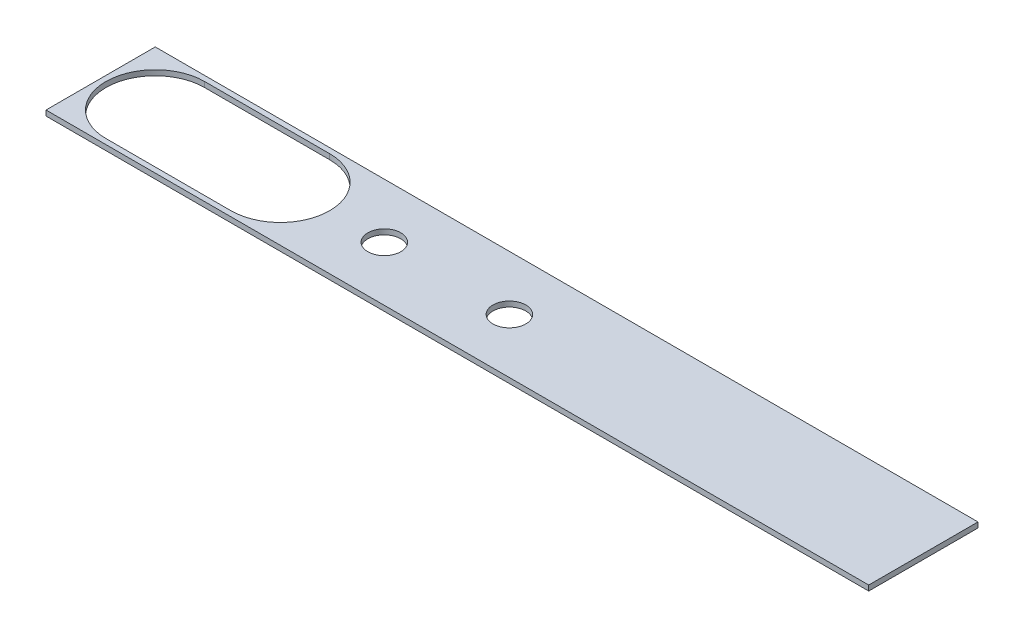
ISO-10303-21;
HEADER;
FILE_DESCRIPTION(('STEP AP214'),'2;1');
FILE_NAME('part.step','',(''),(''),'','','');
FILE_SCHEMA(('AUTOMOTIVE_DESIGN { 1 0 10303 214 1 1 1 1 }'));
ENDSEC;
DATA;
#1=APPLICATION_CONTEXT('core data for automotive mechanical design processes');
#2=APPLICATION_PROTOCOL_DEFINITION('international standard','automotive_design',2000,#1);
#3=PRODUCT_CONTEXT('',#1,'mechanical');
#4=PRODUCT('Part','Part','',(#3));
#5=PRODUCT_RELATED_PRODUCT_CATEGORY('part','',(#4));
#6=PRODUCT_DEFINITION_FORMATION('','',#4);
#7=PRODUCT_DEFINITION_CONTEXT('part definition',#1,'design');
#8=PRODUCT_DEFINITION('design','',#6,#7);
#9=PRODUCT_DEFINITION_SHAPE('','',#8);
#10=(LENGTH_UNIT() NAMED_UNIT(*) SI_UNIT(.MILLI.,.METRE.));
#11=(NAMED_UNIT(*) PLANE_ANGLE_UNIT() SI_UNIT($,.RADIAN.));
#12=(NAMED_UNIT(*) SI_UNIT($,.STERADIAN.) SOLID_ANGLE_UNIT());
#13=UNCERTAINTY_MEASURE_WITH_UNIT(LENGTH_MEASURE(1.E-05),#10,'distance_accuracy_value','');
#14=(GEOMETRIC_REPRESENTATION_CONTEXT(3) GLOBAL_UNCERTAINTY_ASSIGNED_CONTEXT((#13)) GLOBAL_UNIT_ASSIGNED_CONTEXT((#10,
#11,#12)) REPRESENTATION_CONTEXT('',''));
#15=CARTESIAN_POINT('',(0.,0.,0.));
#16=DIRECTION('',(0.,0.,1.));
#17=DIRECTION('',(1.,0.,0.));
#18=AXIS2_PLACEMENT_3D('',#15,#16,#17);
#19=CARTESIAN_POINT('',(125.,-1.6,-16.6));
#20=DIRECTION('',(1.,0.,0.));
#21=DIRECTION('',(0.,0.,-1.));
#22=AXIS2_PLACEMENT_3D('',#19,#20,#21);
#23=PLANE('',#22);
#24=DIRECTION('',(0.,0.,-1.));
#25=VECTOR('',#24,1.);
#26=CARTESIAN_POINT('',(125.,0.,-16.6));
#27=LINE('',#26,#25);
#28=CARTESIAN_POINT('',(125.,0.,16.6));
#29=VERTEX_POINT('',#28);
#30=CARTESIAN_POINT('',(125.,0.,-16.6));
#31=VERTEX_POINT('',#30);
#32=EDGE_CURVE('E149',#29,#31,#27,.T.);
#33=ORIENTED_EDGE('',*,*,#32,.F.);
#34=DIRECTION('',(0.,1.,0.));
#35=VECTOR('',#34,1.);
#36=CARTESIAN_POINT('',(125.,-1.6,16.6));
#37=LINE('',#36,#35);
#38=CARTESIAN_POINT('',(125.,-1.6,16.6));
#39=VERTEX_POINT('',#38);
#40=EDGE_CURVE('E11',#39,#29,#37,.T.);
#41=ORIENTED_EDGE('',*,*,#40,.F.);
#42=DIRECTION('',(0.,0.,-1.));
#43=VECTOR('',#42,1.);
#44=CARTESIAN_POINT('',(125.,-1.6,-16.6));
#45=LINE('',#44,#43);
#46=CARTESIAN_POINT('',(125.,-1.6,-16.6));
#47=VERTEX_POINT('',#46);
#48=EDGE_CURVE('E151',#39,#47,#45,.T.);
#49=ORIENTED_EDGE('',*,*,#48,.T.);
#50=DIRECTION('',(0.,1.,0.));
#51=VECTOR('',#50,1.);
#52=CARTESIAN_POINT('',(125.,-1.6,-16.6));
#53=LINE('',#52,#51);
#54=EDGE_CURVE('E43',#47,#31,#53,.T.);
#55=ORIENTED_EDGE('',*,*,#54,.T.);
#56=EDGE_LOOP('',(#33,#41,#49,#55));
#57=FACE_BOUND('',#56,.T.);
#58=ADVANCED_FACE('F40',(#57),#23,.T.);
#59=CARTESIAN_POINT('',(-125.,-1.6,16.6));
#60=DIRECTION('',(0.,0.,1.));
#61=DIRECTION('',(1.,0.,0.));
#62=AXIS2_PLACEMENT_3D('',#59,#60,#61);
#63=PLANE('',#62);
#64=DIRECTION('',(1.,0.,0.));
#65=VECTOR('',#64,1.);
#66=CARTESIAN_POINT('',(-125.,0.,16.6));
#67=LINE('',#66,#65);
#68=CARTESIAN_POINT('',(-125.,0.,16.6));
#69=VERTEX_POINT('',#68);
#70=EDGE_CURVE('E155',#69,#29,#67,.T.);
#71=ORIENTED_EDGE('',*,*,#70,.F.);
#72=DIRECTION('',(0.,1.,0.));
#73=VECTOR('',#72,1.);
#74=CARTESIAN_POINT('',(-125.,-1.6,16.6));
#75=LINE('',#74,#73);
#76=CARTESIAN_POINT('',(-125.,-1.6,16.6));
#77=VERTEX_POINT('',#76);
#78=EDGE_CURVE('E48',#77,#69,#75,.T.);
#79=ORIENTED_EDGE('',*,*,#78,.F.);
#80=DIRECTION('',(1.,0.,0.));
#81=VECTOR('',#80,1.);
#82=CARTESIAN_POINT('',(-125.,-1.6,16.6));
#83=LINE('',#82,#81);
#84=EDGE_CURVE('E161',#77,#39,#83,.T.);
#85=ORIENTED_EDGE('',*,*,#84,.T.);
#86=ORIENTED_EDGE('',*,*,#40,.T.);
#87=EDGE_LOOP('',(#71,#79,#85,#86));
#88=FACE_BOUND('',#87,.T.);
#89=ADVANCED_FACE('F186',(#88),#63,.T.);
#90=CARTESIAN_POINT('',(-125.,-1.6,-16.6));
#91=DIRECTION('',(-1.,0.,0.));
#92=DIRECTION('',(0.,0.,1.));
#93=AXIS2_PLACEMENT_3D('',#90,#91,#92);
#94=PLANE('',#93);
#95=DIRECTION('',(0.,0.,1.));
#96=VECTOR('',#95,1.);
#97=CARTESIAN_POINT('',(-125.,0.,-16.6));
#98=LINE('',#97,#96);
#99=CARTESIAN_POINT('',(-125.,0.,-16.6));
#100=VERTEX_POINT('',#99);
#101=EDGE_CURVE('E169',#100,#69,#98,.T.);
#102=ORIENTED_EDGE('',*,*,#101,.F.);
#103=DIRECTION('',(0.,1.,0.));
#104=VECTOR('',#103,1.);
#105=CARTESIAN_POINT('',(-125.,-1.6,-16.6));
#106=LINE('',#105,#104);
#107=CARTESIAN_POINT('',(-125.,-1.6,-16.6));
#108=VERTEX_POINT('',#107);
#109=EDGE_CURVE('E174',#108,#100,#106,.T.);
#110=ORIENTED_EDGE('',*,*,#109,.F.);
#111=DIRECTION('',(0.,0.,1.));
#112=VECTOR('',#111,1.);
#113=CARTESIAN_POINT('',(-125.,-1.6,-16.6));
#114=LINE('',#113,#112);
#115=EDGE_CURVE('E158',#108,#77,#114,.T.);
#116=ORIENTED_EDGE('',*,*,#115,.T.);
#117=ORIENTED_EDGE('',*,*,#78,.T.);
#118=EDGE_LOOP('',(#102,#110,#116,#117));
#119=FACE_BOUND('',#118,.T.);
#120=ADVANCED_FACE('F192',(#119),#94,.T.);
#121=CARTESIAN_POINT('',(-125.,-1.6,-16.6));
#122=DIRECTION('',(0.,0.,-1.));
#123=DIRECTION('',(-1.,0.,0.));
#124=AXIS2_PLACEMENT_3D('',#121,#122,#123);
#125=PLANE('',#124);
#126=DIRECTION('',(-1.,0.,0.));
#127=VECTOR('',#126,1.);
#128=CARTESIAN_POINT('',(-125.,0.,-16.6));
#129=LINE('',#128,#127);
#130=EDGE_CURVE('E166',#31,#100,#129,.T.);
#131=ORIENTED_EDGE('',*,*,#130,.F.);
#132=ORIENTED_EDGE('',*,*,#54,.F.);
#133=DIRECTION('',(-1.,0.,0.));
#134=VECTOR('',#133,1.);
#135=CARTESIAN_POINT('',(-125.,-1.6,-16.6));
#136=LINE('',#135,#134);
#137=EDGE_CURVE('E154',#47,#108,#136,.T.);
#138=ORIENTED_EDGE('',*,*,#137,.T.);
#139=ORIENTED_EDGE('',*,*,#109,.T.);
#140=EDGE_LOOP('',(#131,#132,#138,#139));
#141=FACE_BOUND('',#140,.T.);
#142=ADVANCED_FACE('F182',(#141),#125,.T.);
#143=CARTESIAN_POINT('',(0.,-1.6,0.));
#144=DIRECTION('',(0.,1.,0.));
#145=DIRECTION('',(0.,0.,1.));
#146=AXIS2_PLACEMENT_3D('',#143,#144,#145);
#147=PLANE('',#146);
#148=CARTESIAN_POINT('',(-0.799999999999974,-1.6,0.));
#149=DIRECTION('',(0.,1.,0.));
#150=DIRECTION('',(0.,0.,1.));
#151=AXIS2_PLACEMENT_3D('',#148,#149,#150);
#152=CIRCLE('',#151,4.99999999999999);
#153=CARTESIAN_POINT('',(-0.799999999999974,-1.6,4.99999999999999));
#154=VERTEX_POINT('',#153);
#155=EDGE_CURVE('E145',#154,#154,#152,.T.);
#156=ORIENTED_EDGE('',*,*,#155,.T.);
#157=EDGE_LOOP('',(#156));
#158=FACE_BOUND('',#157,.T.);
#159=DIRECTION('',(-1.,0.,0.));
#160=VECTOR('',#159,1.);
#161=CARTESIAN_POINT('',(-108.4,-1.6,-15.));
#162=LINE('',#161,#160);
#163=CARTESIAN_POINT('',(-70.4,-1.6,-15.));
#164=VERTEX_POINT('',#163);
#165=CARTESIAN_POINT('',(-108.4,-1.6,-15.));
#166=VERTEX_POINT('',#165);
#167=EDGE_CURVE('E135',#164,#166,#162,.T.);
#168=ORIENTED_EDGE('',*,*,#167,.T.);
#169=CARTESIAN_POINT('',(-108.4,-1.6,0.));
#170=DIRECTION('',(0.,1.,0.));
#171=DIRECTION('',(0.,0.,1.));
#172=AXIS2_PLACEMENT_3D('',#169,#170,#171);
#173=CIRCLE('',#172,15.);
#174=CARTESIAN_POINT('',(-108.4,-1.6,15.));
#175=VERTEX_POINT('',#174);
#176=EDGE_CURVE('E107',#166,#175,#173,.T.);
#177=ORIENTED_EDGE('',*,*,#176,.T.);
#178=DIRECTION('',(1.,0.,0.));
#179=VECTOR('',#178,1.);
#180=CARTESIAN_POINT('',(-108.4,-1.6,15.));
#181=LINE('',#180,#179);
#182=CARTESIAN_POINT('',(-70.4,-1.6,15.));
#183=VERTEX_POINT('',#182);
#184=EDGE_CURVE('E139',#175,#183,#181,.T.);
#185=ORIENTED_EDGE('',*,*,#184,.T.);
#186=CARTESIAN_POINT('',(-70.4,-1.6,0.));
#187=DIRECTION('',(0.,1.,0.));
#188=DIRECTION('',(0.,0.,1.));
#189=AXIS2_PLACEMENT_3D('',#186,#187,#188);
#190=CIRCLE('',#189,15.);
#191=EDGE_CURVE('E56',#183,#164,#190,.T.);
#192=ORIENTED_EDGE('',*,*,#191,.T.);
#193=EDGE_LOOP('',(#168,#177,#185,#192));
#194=FACE_BOUND('',#193,.T.);
#195=CARTESIAN_POINT('',(-38.8,-1.6,0.));
#196=DIRECTION('',(0.,1.,0.));
#197=DIRECTION('',(0.,0.,1.));
#198=AXIS2_PLACEMENT_3D('',#195,#196,#197);
#199=CIRCLE('',#198,4.99999999999999);
#200=CARTESIAN_POINT('',(-38.8,-1.6,4.99999999999999));
#201=VERTEX_POINT('',#200);
#202=EDGE_CURVE('E130',#201,#201,#199,.T.);
#203=ORIENTED_EDGE('',*,*,#202,.T.);
#204=EDGE_LOOP('',(#203));
#205=FACE_BOUND('',#204,.T.);
#206=ORIENTED_EDGE('',*,*,#48,.F.);
#207=ORIENTED_EDGE('',*,*,#84,.F.);
#208=ORIENTED_EDGE('',*,*,#115,.F.);
#209=ORIENTED_EDGE('',*,*,#137,.F.);
#210=EDGE_LOOP('',(#206,#207,#208,#209));
#211=FACE_BOUND('',#210,.T.);
#212=ADVANCED_FACE('F189',(#158,#194,#205,#211),#147,.F.);
#213=CARTESIAN_POINT('',(0.,0.,0.));
#214=DIRECTION('',(0.,1.,0.));
#215=DIRECTION('',(0.,0.,1.));
#216=AXIS2_PLACEMENT_3D('',#213,#214,#215);
#217=PLANE('',#216);
#218=CARTESIAN_POINT('',(-0.799999999999974,0.,0.));
#219=DIRECTION('',(0.,1.,0.));
#220=DIRECTION('',(0.,0.,1.));
#221=AXIS2_PLACEMENT_3D('',#218,#219,#220);
#222=CIRCLE('',#221,4.99999999999999);
#223=CARTESIAN_POINT('',(-0.799999999999974,0.,4.99999999999999));
#224=VERTEX_POINT('',#223);
#225=EDGE_CURVE('E112',#224,#224,#222,.T.);
#226=ORIENTED_EDGE('',*,*,#225,.F.);
#227=EDGE_LOOP('',(#226));
#228=FACE_BOUND('',#227,.T.);
#229=CARTESIAN_POINT('',(-108.4,0.,0.));
#230=DIRECTION('',(0.,1.,0.));
#231=DIRECTION('',(0.,0.,1.));
#232=AXIS2_PLACEMENT_3D('',#229,#230,#231);
#233=CIRCLE('',#232,15.);
#234=CARTESIAN_POINT('',(-108.4,0.,-15.));
#235=VERTEX_POINT('',#234);
#236=CARTESIAN_POINT('',(-108.4,0.,15.));
#237=VERTEX_POINT('',#236);
#238=EDGE_CURVE('E64',#235,#237,#233,.T.);
#239=ORIENTED_EDGE('',*,*,#238,.F.);
#240=DIRECTION('',(-1.,0.,0.));
#241=VECTOR('',#240,1.);
#242=CARTESIAN_POINT('',(-108.4,0.,-15.));
#243=LINE('',#242,#241);
#244=CARTESIAN_POINT('',(-70.4,0.,-15.));
#245=VERTEX_POINT('',#244);
#246=EDGE_CURVE('E115',#245,#235,#243,.T.);
#247=ORIENTED_EDGE('',*,*,#246,.F.);
#248=CARTESIAN_POINT('',(-70.4,0.,0.));
#249=DIRECTION('',(0.,1.,0.));
#250=DIRECTION('',(0.,0.,1.));
#251=AXIS2_PLACEMENT_3D('',#248,#249,#250);
#252=CIRCLE('',#251,15.);
#253=CARTESIAN_POINT('',(-70.4,0.,15.));
#254=VERTEX_POINT('',#253);
#255=EDGE_CURVE('E120',#254,#245,#252,.T.);
#256=ORIENTED_EDGE('',*,*,#255,.F.);
#257=DIRECTION('',(1.,0.,0.));
#258=VECTOR('',#257,1.);
#259=CARTESIAN_POINT('',(-108.4,0.,15.));
#260=LINE('',#259,#258);
#261=EDGE_CURVE('E126',#237,#254,#260,.T.);
#262=ORIENTED_EDGE('',*,*,#261,.F.);
#263=EDGE_LOOP('',(#239,#247,#256,#262));
#264=FACE_BOUND('',#263,.T.);
#265=CARTESIAN_POINT('',(-38.8,0.,0.));
#266=DIRECTION('',(0.,1.,0.));
#267=DIRECTION('',(0.,0.,1.));
#268=AXIS2_PLACEMENT_3D('',#265,#266,#267);
#269=CIRCLE('',#268,4.99999999999999);
#270=CARTESIAN_POINT('',(-38.8,0.,4.99999999999999));
#271=VERTEX_POINT('',#270);
#272=EDGE_CURVE('E127',#271,#271,#269,.T.);
#273=ORIENTED_EDGE('',*,*,#272,.F.);
#274=EDGE_LOOP('',(#273));
#275=FACE_BOUND('',#274,.T.);
#276=ORIENTED_EDGE('',*,*,#32,.T.);
#277=ORIENTED_EDGE('',*,*,#130,.T.);
#278=ORIENTED_EDGE('',*,*,#101,.T.);
#279=ORIENTED_EDGE('',*,*,#70,.T.);
#280=EDGE_LOOP('',(#276,#277,#278,#279));
#281=FACE_BOUND('',#280,.T.);
#282=ADVANCED_FACE('F123',(#228,#264,#275,#281),#217,.T.);
#283=CARTESIAN_POINT('',(-38.8,-1.6,0.));
#284=DIRECTION('',(0.,1.,0.));
#285=DIRECTION('',(0.,0.,1.));
#286=AXIS2_PLACEMENT_3D('',#283,#284,#285);
#287=CYLINDRICAL_SURFACE('',#286,4.99999999999999);
#288=ORIENTED_EDGE('',*,*,#202,.F.);
#289=EDGE_LOOP('',(#288));
#290=FACE_BOUND('',#289,.T.);
#291=ORIENTED_EDGE('',*,*,#272,.T.);
#292=EDGE_LOOP('',(#291));
#293=FACE_BOUND('',#292,.T.);
#294=ADVANCED_FACE('F237',(#290,#293),#287,.F.);
#295=CARTESIAN_POINT('',(-108.4,-1.6,0.));
#296=DIRECTION('',(0.,1.,0.));
#297=DIRECTION('',(0.,0.,1.));
#298=AXIS2_PLACEMENT_3D('',#295,#296,#297);
#299=CYLINDRICAL_SURFACE('',#298,15.);
#300=ORIENTED_EDGE('',*,*,#238,.T.);
#301=DIRECTION('',(0.,1.,0.));
#302=VECTOR('',#301,1.);
#303=CARTESIAN_POINT('',(-108.4,-1.6,15.));
#304=LINE('',#303,#302);
#305=EDGE_CURVE('E137',#175,#237,#304,.T.);
#306=ORIENTED_EDGE('',*,*,#305,.F.);
#307=ORIENTED_EDGE('',*,*,#176,.F.);
#308=DIRECTION('',(0.,1.,0.));
#309=VECTOR('',#308,1.);
#310=CARTESIAN_POINT('',(-108.4,-1.6,-15.));
#311=LINE('',#310,#309);
#312=EDGE_CURVE('E103',#166,#235,#311,.T.);
#313=ORIENTED_EDGE('',*,*,#312,.T.);
#314=EDGE_LOOP('',(#300,#306,#307,#313));
#315=FACE_BOUND('',#314,.T.);
#316=ADVANCED_FACE('F105',(#315),#299,.F.);
#317=CARTESIAN_POINT('',(-108.4,-1.6,-15.));
#318=DIRECTION('',(0.,0.,-1.));
#319=DIRECTION('',(-1.,0.,0.));
#320=AXIS2_PLACEMENT_3D('',#317,#318,#319);
#321=PLANE('',#320);
#322=ORIENTED_EDGE('',*,*,#246,.T.);
#323=ORIENTED_EDGE('',*,*,#312,.F.);
#324=ORIENTED_EDGE('',*,*,#167,.F.);
#325=DIRECTION('',(0.,1.,0.));
#326=VECTOR('',#325,1.);
#327=CARTESIAN_POINT('',(-70.4,-1.6,-15.));
#328=LINE('',#327,#326);
#329=EDGE_CURVE('E111',#164,#245,#328,.T.);
#330=ORIENTED_EDGE('',*,*,#329,.T.);
#331=EDGE_LOOP('',(#322,#323,#324,#330));
#332=FACE_BOUND('',#331,.T.);
#333=ADVANCED_FACE('F116',(#332),#321,.F.);
#334=CARTESIAN_POINT('',(-70.4,-1.6,0.));
#335=DIRECTION('',(0.,1.,0.));
#336=DIRECTION('',(0.,0.,1.));
#337=AXIS2_PLACEMENT_3D('',#334,#335,#336);
#338=CYLINDRICAL_SURFACE('',#337,15.);
#339=ORIENTED_EDGE('',*,*,#255,.T.);
#340=ORIENTED_EDGE('',*,*,#329,.F.);
#341=ORIENTED_EDGE('',*,*,#191,.F.);
#342=DIRECTION('',(0.,1.,0.));
#343=VECTOR('',#342,1.);
#344=CARTESIAN_POINT('',(-70.4,-1.6,15.));
#345=LINE('',#344,#343);
#346=EDGE_CURVE('E304',#183,#254,#345,.T.);
#347=ORIENTED_EDGE('',*,*,#346,.T.);
#348=EDGE_LOOP('',(#339,#340,#341,#347));
#349=FACE_BOUND('',#348,.T.);
#350=ADVANCED_FACE('F264',(#349),#338,.F.);
#351=CARTESIAN_POINT('',(-108.4,-1.6,15.));
#352=DIRECTION('',(0.,0.,1.));
#353=DIRECTION('',(1.,0.,0.));
#354=AXIS2_PLACEMENT_3D('',#351,#352,#353);
#355=PLANE('',#354);
#356=ORIENTED_EDGE('',*,*,#261,.T.);
#357=ORIENTED_EDGE('',*,*,#346,.F.);
#358=ORIENTED_EDGE('',*,*,#184,.F.);
#359=ORIENTED_EDGE('',*,*,#305,.T.);
#360=EDGE_LOOP('',(#356,#357,#358,#359));
#361=FACE_BOUND('',#360,.T.);
#362=ADVANCED_FACE('F273',(#361),#355,.F.);
#363=CARTESIAN_POINT('',(-0.799999999999974,-1.6,0.));
#364=DIRECTION('',(0.,1.,0.));
#365=DIRECTION('',(0.,0.,1.));
#366=AXIS2_PLACEMENT_3D('',#363,#364,#365);
#367=CYLINDRICAL_SURFACE('',#366,4.99999999999999);
#368=ORIENTED_EDGE('',*,*,#155,.F.);
#369=EDGE_LOOP('',(#368));
#370=FACE_BOUND('',#369,.T.);
#371=ORIENTED_EDGE('',*,*,#225,.T.);
#372=EDGE_LOOP('',(#371));
#373=FACE_BOUND('',#372,.T.);
#374=ADVANCED_FACE('F282',(#370,#373),#367,.F.);
#375=CLOSED_SHELL('',(#58,#89,#120,#142,#212,#282,#294,#316,#333,#350,#362,#374));
#376=MANIFOLD_SOLID_BREP('B2',#375);
#377=ADVANCED_BREP_SHAPE_REPRESENTATION('',(#18,#376),#14);
#378=SHAPE_DEFINITION_REPRESENTATION(#9,#377);
ENDSEC;
END-ISO-10303-21;
